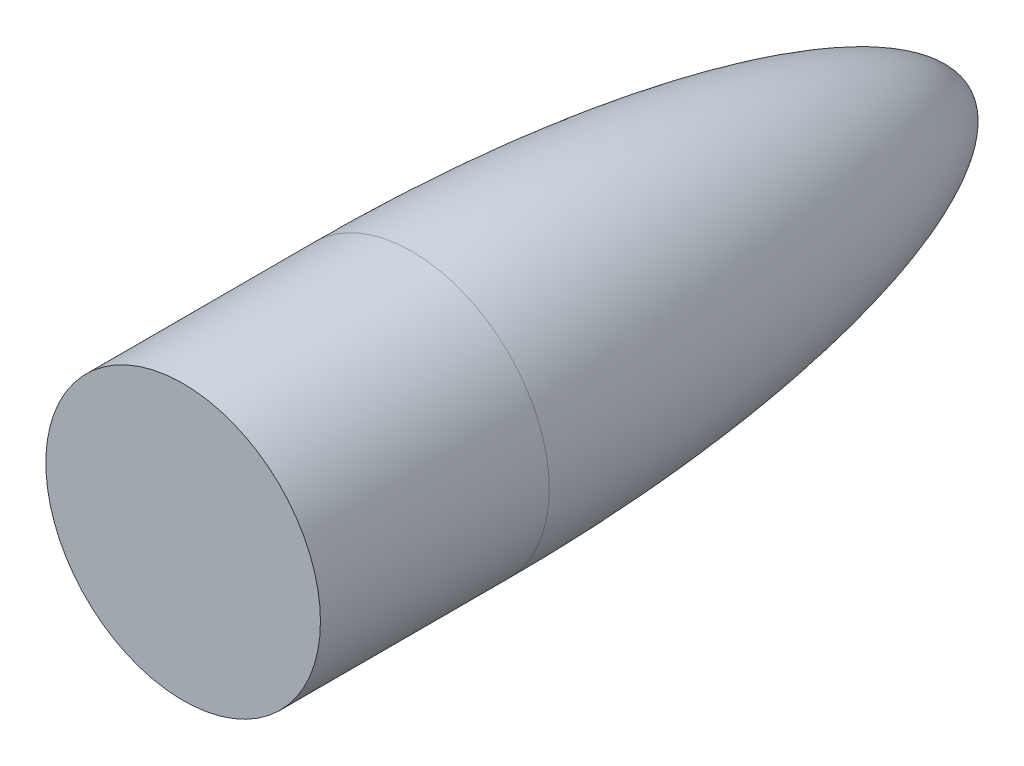
ISO-10303-21;
HEADER;
FILE_DESCRIPTION(('STEP AP214'),'2;1');
FILE_NAME('part.step','',(''),(''),'','','');
FILE_SCHEMA(('AUTOMOTIVE_DESIGN { 1 0 10303 214 1 1 1 1 }'));
ENDSEC;
DATA;
#1=APPLICATION_CONTEXT('core data for automotive mechanical design processes');
#2=APPLICATION_PROTOCOL_DEFINITION('international standard','automotive_design',2000,#1);
#3=PRODUCT_CONTEXT('',#1,'mechanical');
#4=PRODUCT('Part','Part','',(#3));
#5=PRODUCT_RELATED_PRODUCT_CATEGORY('part','',(#4));
#6=PRODUCT_DEFINITION_FORMATION('','',#4);
#7=PRODUCT_DEFINITION_CONTEXT('part definition',#1,'design');
#8=PRODUCT_DEFINITION('design','',#6,#7);
#9=PRODUCT_DEFINITION_SHAPE('','',#8);
#10=(LENGTH_UNIT() NAMED_UNIT(*) SI_UNIT(.MILLI.,.METRE.));
#11=(NAMED_UNIT(*) PLANE_ANGLE_UNIT() SI_UNIT($,.RADIAN.));
#12=(NAMED_UNIT(*) SI_UNIT($,.STERADIAN.) SOLID_ANGLE_UNIT());
#13=UNCERTAINTY_MEASURE_WITH_UNIT(LENGTH_MEASURE(1.E-05),#10,'distance_accuracy_value','');
#14=(GEOMETRIC_REPRESENTATION_CONTEXT(3) GLOBAL_UNCERTAINTY_ASSIGNED_CONTEXT((#13)) GLOBAL_UNIT_ASSIGNED_CONTEXT((#10,
#11,#12)) REPRESENTATION_CONTEXT('',''));
#15=CARTESIAN_POINT('',(0.,0.,0.));
#16=DIRECTION('',(0.,0.,1.));
#17=DIRECTION('',(1.,0.,0.));
#18=AXIS2_PLACEMENT_3D('',#15,#16,#17);
#19=CARTESIAN_POINT('',(0.,0.,127.));
#20=DIRECTION('',(0.,0.,-1.));
#21=DIRECTION('',(-1.,0.,0.));
#22=AXIS2_PLACEMENT_3D('',#19,#20,#21);
#23=CYLINDRICAL_SURFACE('',#22,76.2);
#24=CARTESIAN_POINT('',(0.,0.,127.));
#25=DIRECTION('',(0.,0.,1.));
#26=DIRECTION('',(1.,0.,0.));
#27=AXIS2_PLACEMENT_3D('',#24,#25,#26);
#28=CIRCLE('',#27,76.2);
#29=CARTESIAN_POINT('',(76.2,0.,127.));
#30=VERTEX_POINT('',#29);
#31=EDGE_CURVE('E11',#30,#30,#28,.T.);
#32=ORIENTED_EDGE('',*,*,#31,.F.);
#33=EDGE_LOOP('',(#32));
#34=FACE_BOUND('',#33,.T.);
#35=CARTESIAN_POINT('',(0.,0.,0.));
#36=DIRECTION('',(0.,0.,1.));
#37=DIRECTION('',(1.,0.,0.));
#38=AXIS2_PLACEMENT_3D('',#35,#36,#37);
#39=CIRCLE('',#38,76.2);
#40=CARTESIAN_POINT('',(76.2,0.,0.));
#41=VERTEX_POINT('',#40);
#42=EDGE_CURVE('E54',#41,#41,#39,.T.);
#43=ORIENTED_EDGE('',*,*,#42,.T.);
#44=EDGE_LOOP('',(#43));
#45=FACE_BOUND('',#44,.T.);
#46=ADVANCED_FACE('F43',(#34,#45),#23,.T.);
#47=CARTESIAN_POINT('',(0.,0.,127.));
#48=DIRECTION('',(0.,0.,1.));
#49=DIRECTION('',(1.,0.,0.));
#50=AXIS2_PLACEMENT_3D('',#47,#48,#49);
#51=PLANE('',#50);
#52=ORIENTED_EDGE('',*,*,#31,.T.);
#53=EDGE_LOOP('',(#52));
#54=FACE_BOUND('',#53,.T.);
#55=ADVANCED_FACE('F59',(#54),#51,.T.);
#56=CARTESIAN_POINT('',(0.,0.,-304.800000000027));
#57=CARTESIAN_POINT('',(0.,0.613054440823734,-304.799951450127));
#58=CARTESIAN_POINT('',(0.,1.71101445619841,-304.752906125328));
#59=CARTESIAN_POINT('',(0.,3.3260813227413,-304.558560023899));
#60=CARTESIAN_POINT('',(0.,5.45857504578594,-304.062033092245));
#61=CARTESIAN_POINT('',(0.,7.55858937911988,-303.347876694877));
#62=CARTESIAN_POINT('',(0.,9.80545980555127,-302.325687861701));
#63=CARTESIAN_POINT('',(0.,12.2476657629699,-300.910177315635));
#64=CARTESIAN_POINT('',(0.,14.9493793196911,-298.968593495669));
#65=CARTESIAN_POINT('',(0.,17.9901652559359,-296.304852606071));
#66=CARTESIAN_POINT('',(0.,21.4624852738671,-292.625625405248));
#67=CARTESIAN_POINT('',(0.,25.4001346788887,-287.593205526098));
#68=CARTESIAN_POINT('',(0.,29.899459648064,-280.667817924147));
#69=CARTESIAN_POINT('',(0.,34.77422735003,-271.607441703915));
#70=CARTESIAN_POINT('',(0.,40.6596806575343,-258.457016360257));
#71=CARTESIAN_POINT('',(0.,46.7933746507628,-241.454240171773));
#72=CARTESIAN_POINT('',(0.,51.8467906585434,-224.106235056527));
#73=CARTESIAN_POINT('',(0.,56.0285292212848,-206.996537877118));
#74=CARTESIAN_POINT('',(0.,59.0986270010413,-192.645885151788));
#75=CARTESIAN_POINT('',(0.,61.3311971126815,-181.119671143081));
#76=CARTESIAN_POINT('',(0.,63.3613160030068,-169.556420782122));
#77=CARTESIAN_POINT('',(0.,65.2052789260888,-157.961963266789));
#78=CARTESIAN_POINT('',(0.,66.876933899107,-146.341577132254));
#79=CARTESIAN_POINT('',(0.,68.3874051114271,-134.699118226829));
#80=CARTESIAN_POINT('',(0.,69.7461513069098,-123.038081299575));
#81=CARTESIAN_POINT('',(0.,70.9609570971131,-111.361129822101));
#82=CARTESIAN_POINT('',(0.,71.9037450874657,-101.13212406027));
#83=CARTESIAN_POINT('',(0.,72.6294390067137,-92.3571538425361));
#84=CARTESIAN_POINT('',(0.,73.180691624905,-85.0407083170665));
#85=CARTESIAN_POINT('',(0.,73.5901181948318,-79.1848981728062));
#86=CARTESIAN_POINT('',(0.,73.9684510374974,-73.3277244279747));
#87=CARTESIAN_POINT('',(0.,74.3161200030092,-67.4673641089066));
#88=CARTESIAN_POINT('',(0.,74.6335178978756,-61.6074639987492));
#89=CARTESIAN_POINT('',(0.,74.9209947795706,-55.7424003124845));
#90=CARTESIAN_POINT('',(0.,75.1788649241253,-49.8819438504088));
#91=CARTESIAN_POINT('',(0.,75.4074055396848,-44.0104038909042));
#92=CARTESIAN_POINT('',(0.,75.606860131868,-38.154069004822));
#93=CARTESIAN_POINT('',(0.,75.7774386845273,-32.2699894212062));
#94=CARTESIAN_POINT('',(0.,75.9193194525565,-26.4295618889874));
#95=CARTESIAN_POINT('',(0.,76.0326494722084,-20.5142517402379));
#96=CARTESIAN_POINT('',(0.,76.1175455720523,-14.7263481038973));
#97=CARTESIAN_POINT('',(0.,76.167026156336,-9.45243574790334));
#98=CARTESIAN_POINT('',(0.,76.1917574405948,-5.27624795749148));
#99=CARTESIAN_POINT('',(0.,76.1988224916883,-2.02326531865424));
#100=CARTESIAN_POINT('',(0.,76.2,-0.671133462669145));
#101=CARTESIAN_POINT('',(0.,76.2,2.68349423680986E-11));
#102=B_SPLINE_CURVE_WITH_KNOTS('',4,(#56,#57,#58,#59,#60,#61,#62,#63,#64,#65,#66,#67,#68,#69,
#70,#71,#72,#73,#74,#75,#76,#77,#78,#79,#80,#81,#82,#83,#84,#85,#86,#87,#88,#89,#90,#91,#92,#93,
#94,#95,#96,#97,#98,#99,#100,#101),.UNSPECIFIED.,.F.,.F.,(5,1,1,1,1,1,1,1,1,1,1,1,1,1,1,1,1,1,1,
1,1,1,1,1,1,1,1,1,1,1,1,1,1,1,1,1,1,1,1,1,1,1,5),(0.0853103774468524,0.0921672415538664,
0.0976116850254836,0.103474505169766,0.109784467907309,0.116955885354606,0.125201305855,
0.135022991698166,0.146971000031237,0.162141605689949,0.181752413650756,0.206456965452566,
0.239311470034772,0.277198265366376,0.342907503692961,0.408616743039687,0.441471371301994,
0.4743259995643,0.507180622958797,0.540035246353293,0.572889870837842,0.605744495322392,
0.638599119714251,0.67145374410611,0.704308369710712,0.737162995315315,0.753590308195268,
0.770017621075221,0.786444933955173,0.802872246835126,0.819299559695901,0.835726872556676,
0.852154185417452,0.868581498278227,0.885008810977506,0.901436123676785,0.917863436376064,
0.934290749075344,0.950718061806508,0.967145374537672,0.983572687268836,0.991786343634418,1.),.UNSPECIFIED.);
#103=CARTESIAN_POINT('',(0.,0.,-480.060000000396));
#104=DIRECTION('',(0.,0.,-1.));
#105=AXIS1_PLACEMENT('',#103,#104);
#106=SURFACE_OF_REVOLUTION('',#102,#105);
#107=ORIENTED_EDGE('',*,*,#42,.F.);
#108=EDGE_LOOP('',(#107));
#109=FACE_BOUND('',#108,.T.);
#110=CARTESIAN_POINT('',(0.,0.,-304.800000000027));
#111=VERTEX_POINT('',#110);
#112=VERTEX_LOOP('',#111);
#113=FACE_BOUND('',#112,.T.);
#114=ADVANCED_FACE('F45',(#109,#113),#106,.F.);
#115=CLOSED_SHELL('',(#46,#55,#114));
#116=MANIFOLD_SOLID_BREP('B2',#115);
#117=ADVANCED_BREP_SHAPE_REPRESENTATION('',(#18,#116),#14);
#118=SHAPE_DEFINITION_REPRESENTATION(#9,#117);
ENDSEC;
END-ISO-10303-21;
